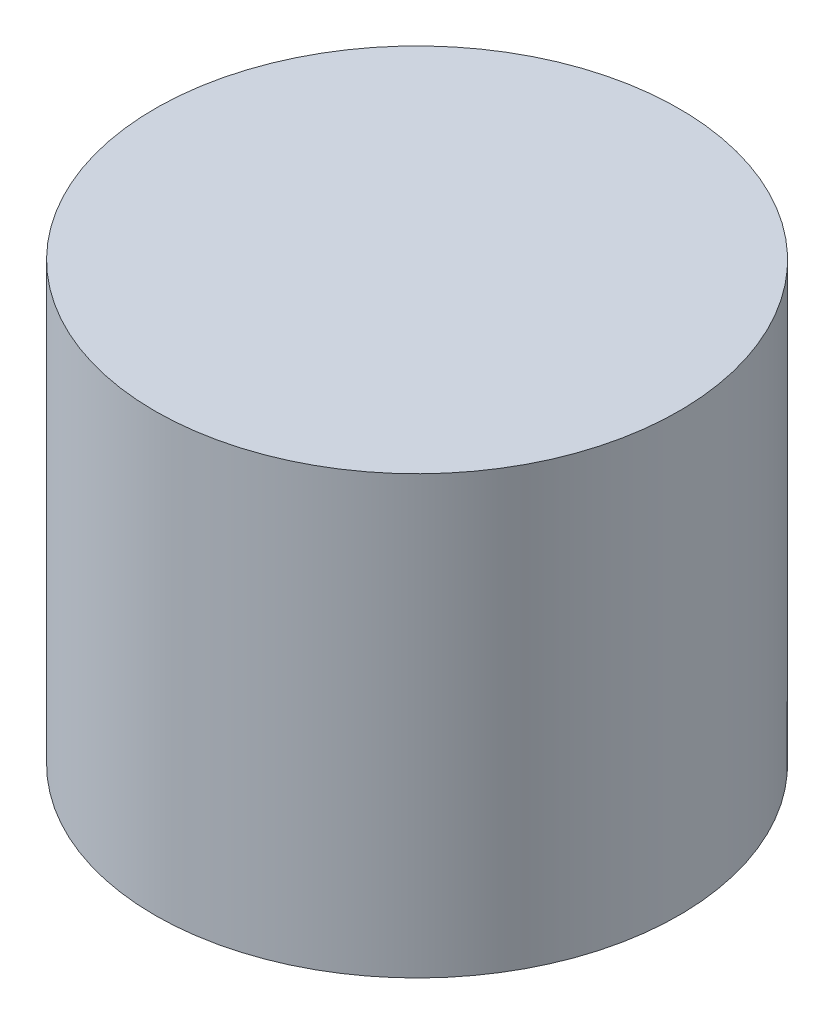
ISO-10303-21;
HEADER;
FILE_DESCRIPTION(('STEP AP214'),'2;1');
FILE_NAME('part.step','',(''),(''),'','','');
FILE_SCHEMA(('AUTOMOTIVE_DESIGN { 1 0 10303 214 1 1 1 1 }'));
ENDSEC;
DATA;
#1=APPLICATION_CONTEXT('core data for automotive mechanical design processes');
#2=APPLICATION_PROTOCOL_DEFINITION('international standard','automotive_design',2000,#1);
#3=PRODUCT_CONTEXT('',#1,'mechanical');
#4=PRODUCT('Part','Part','',(#3));
#5=PRODUCT_RELATED_PRODUCT_CATEGORY('part','',(#4));
#6=PRODUCT_DEFINITION_FORMATION('','',#4);
#7=PRODUCT_DEFINITION_CONTEXT('part definition',#1,'design');
#8=PRODUCT_DEFINITION('design','',#6,#7);
#9=PRODUCT_DEFINITION_SHAPE('','',#8);
#10=(LENGTH_UNIT() NAMED_UNIT(*) SI_UNIT(.MILLI.,.METRE.));
#11=(NAMED_UNIT(*) PLANE_ANGLE_UNIT() SI_UNIT($,.RADIAN.));
#12=(NAMED_UNIT(*) SI_UNIT($,.STERADIAN.) SOLID_ANGLE_UNIT());
#13=UNCERTAINTY_MEASURE_WITH_UNIT(LENGTH_MEASURE(1.E-05),#10,'distance_accuracy_value','');
#14=(GEOMETRIC_REPRESENTATION_CONTEXT(3) GLOBAL_UNCERTAINTY_ASSIGNED_CONTEXT((#13)) GLOBAL_UNIT_ASSIGNED_CONTEXT((#10,
#11,#12)) REPRESENTATION_CONTEXT('',''));
#15=CARTESIAN_POINT('',(0.,0.,0.));
#16=DIRECTION('',(0.,0.,1.));
#17=DIRECTION('',(1.,0.,0.));
#18=AXIS2_PLACEMENT_3D('',#15,#16,#17);
#19=CARTESIAN_POINT('',(0.,10.,0.));
#20=DIRECTION('',(0.,-1.,0.));
#21=DIRECTION('',(0.,0.,-1.));
#22=AXIS2_PLACEMENT_3D('',#19,#20,#21);
#23=CYLINDRICAL_SURFACE('',#22,6.);
#24=CARTESIAN_POINT('',(0.,10.,0.));
#25=DIRECTION('',(0.,1.,0.));
#26=DIRECTION('',(0.,0.,1.));
#27=AXIS2_PLACEMENT_3D('',#24,#25,#26);
#28=CIRCLE('',#27,6.);
#29=CARTESIAN_POINT('',(0.,10.,6.));
#30=VERTEX_POINT('',#29);
#31=EDGE_CURVE('E10',#30,#30,#28,.T.);
#32=ORIENTED_EDGE('',*,*,#31,.F.);
#33=EDGE_LOOP('',(#32));
#34=FACE_BOUND('',#33,.T.);
#35=CARTESIAN_POINT('',(0.,0.,0.));
#36=DIRECTION('',(0.,1.,0.));
#37=DIRECTION('',(0.,0.,1.));
#38=AXIS2_PLACEMENT_3D('',#35,#36,#37);
#39=CIRCLE('',#38,6.);
#40=CARTESIAN_POINT('',(0.,0.,6.));
#41=VERTEX_POINT('',#40);
#42=EDGE_CURVE('E40',#41,#41,#39,.T.);
#43=ORIENTED_EDGE('',*,*,#42,.T.);
#44=EDGE_LOOP('',(#43));
#45=FACE_BOUND('',#44,.T.);
#46=ADVANCED_FACE('F37',(#34,#45),#23,.T.);
#47=CARTESIAN_POINT('',(0.,10.,0.));
#48=DIRECTION('',(0.,1.,0.));
#49=DIRECTION('',(0.,0.,1.));
#50=AXIS2_PLACEMENT_3D('',#47,#48,#49);
#51=PLANE('',#50);
#52=ORIENTED_EDGE('',*,*,#31,.T.);
#53=EDGE_LOOP('',(#52));
#54=FACE_BOUND('',#53,.T.);
#55=ADVANCED_FACE('F54',(#54),#51,.T.);
#56=CARTESIAN_POINT('',(0.,0.,0.));
#57=DIRECTION('',(0.,1.,0.));
#58=DIRECTION('',(0.,0.,1.));
#59=AXIS2_PLACEMENT_3D('',#56,#57,#58);
#60=PLANE('',#59);
#61=ORIENTED_EDGE('',*,*,#42,.F.);
#62=EDGE_LOOP('',(#61));
#63=FACE_BOUND('',#62,.T.);
#64=ADVANCED_FACE('F52',(#63),#60,.F.);
#65=CLOSED_SHELL('',(#46,#55,#64));
#66=MANIFOLD_SOLID_BREP('B2',#65);
#67=ADVANCED_BREP_SHAPE_REPRESENTATION('',(#18,#66),#14);
#68=SHAPE_DEFINITION_REPRESENTATION(#9,#67);
ENDSEC;
END-ISO-10303-21;
